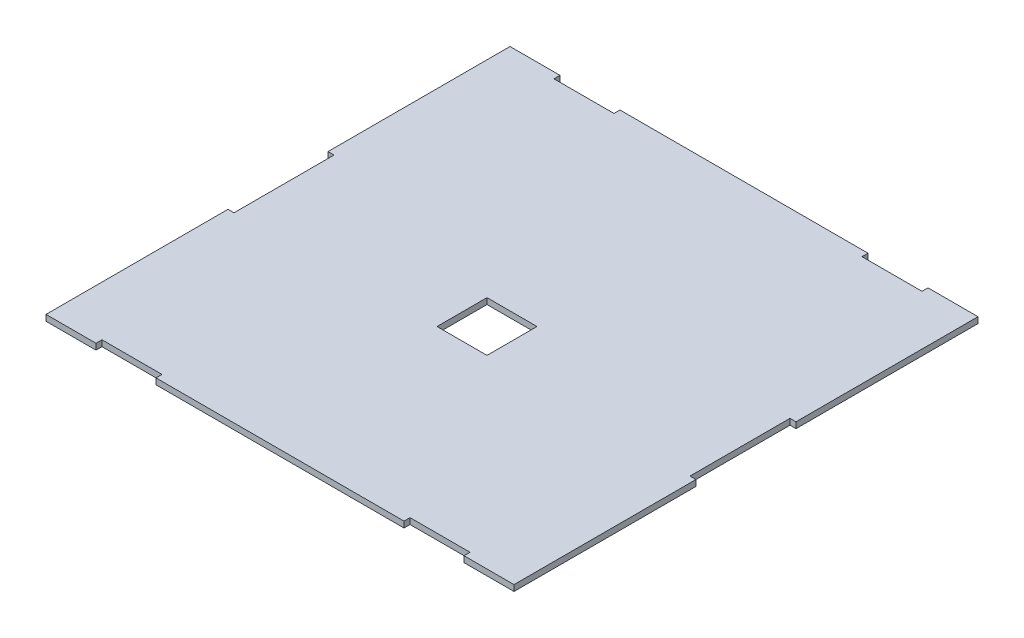
ISO-10303-21;
HEADER;
FILE_DESCRIPTION(('STEP AP214'),'2;1');
FILE_NAME('part.step','',(''),(''),'','','');
FILE_SCHEMA(('AUTOMOTIVE_DESIGN { 1 0 10303 214 1 1 1 1 }'));
ENDSEC;
DATA;
#1=APPLICATION_CONTEXT('core data for automotive mechanical design processes');
#2=APPLICATION_PROTOCOL_DEFINITION('international standard','automotive_design',2000,#1);
#3=PRODUCT_CONTEXT('',#1,'mechanical');
#4=PRODUCT('Part','Part','',(#3));
#5=PRODUCT_RELATED_PRODUCT_CATEGORY('part','',(#4));
#6=PRODUCT_DEFINITION_FORMATION('','',#4);
#7=PRODUCT_DEFINITION_CONTEXT('part definition',#1,'design');
#8=PRODUCT_DEFINITION('design','',#6,#7);
#9=PRODUCT_DEFINITION_SHAPE('','',#8);
#10=(LENGTH_UNIT() NAMED_UNIT(*) SI_UNIT(.MILLI.,.METRE.));
#11=(NAMED_UNIT(*) PLANE_ANGLE_UNIT() SI_UNIT($,.RADIAN.));
#12=(NAMED_UNIT(*) SI_UNIT($,.STERADIAN.) SOLID_ANGLE_UNIT());
#13=UNCERTAINTY_MEASURE_WITH_UNIT(LENGTH_MEASURE(1.E-05),#10,'distance_accuracy_value','');
#14=(GEOMETRIC_REPRESENTATION_CONTEXT(3) GLOBAL_UNCERTAINTY_ASSIGNED_CONTEXT((#13)) GLOBAL_UNIT_ASSIGNED_CONTEXT((#10,
#11,#12)) REPRESENTATION_CONTEXT('',''));
#15=CARTESIAN_POINT('',(0.,0.,0.));
#16=DIRECTION('',(0.,0.,1.));
#17=DIRECTION('',(1.,0.,0.));
#18=AXIS2_PLACEMENT_3D('',#15,#16,#17);
#19=CARTESIAN_POINT('',(0.,3.,-232.));
#20=DIRECTION('',(0.,0.,-1.));
#21=DIRECTION('',(-1.,0.,0.));
#22=AXIS2_PLACEMENT_3D('',#19,#20,#21);
#23=PLANE('',#22);
#24=DIRECTION('',(1.,0.,0.));
#25=VECTOR('',#24,1.);
#26=CARTESIAN_POINT('',(0.,0.,-232.));
#27=LINE('',#26,#25);
#28=CARTESIAN_POINT('',(209.,0.,-232.));
#29=VERTEX_POINT('',#28);
#30=CARTESIAN_POINT('',(234.,0.,-232.));
#31=VERTEX_POINT('',#30);
#32=EDGE_CURVE('E308',#29,#31,#27,.T.);
#33=ORIENTED_EDGE('',*,*,#32,.F.);
#34=DIRECTION('',(0.,-1.,0.));
#35=VECTOR('',#34,1.);
#36=CARTESIAN_POINT('',(209.,3.,-232.));
#37=LINE('',#36,#35);
#38=CARTESIAN_POINT('',(209.,3.,-232.));
#39=VERTEX_POINT('',#38);
#40=EDGE_CURVE('E11',#39,#29,#37,.T.);
#41=ORIENTED_EDGE('',*,*,#40,.F.);
#42=DIRECTION('',(1.,0.,0.));
#43=VECTOR('',#42,1.);
#44=CARTESIAN_POINT('',(0.,3.,-232.));
#45=LINE('',#44,#43);
#46=CARTESIAN_POINT('',(234.,3.,-232.));
#47=VERTEX_POINT('',#46);
#48=EDGE_CURVE('E573',#39,#47,#45,.T.);
#49=ORIENTED_EDGE('',*,*,#48,.T.);
#50=DIRECTION('',(0.,-1.,0.));
#51=VECTOR('',#50,1.);
#52=CARTESIAN_POINT('',(234.,3.,-232.));
#53=LINE('',#52,#51);
#54=EDGE_CURVE('E61',#47,#31,#53,.T.);
#55=ORIENTED_EDGE('',*,*,#54,.T.);
#56=EDGE_LOOP('',(#33,#41,#49,#55));
#57=FACE_BOUND('',#56,.T.);
#58=ADVANCED_FACE('F41',(#57),#23,.T.);
#59=CARTESIAN_POINT('',(209.,3.,0.));
#60=DIRECTION('',(1.,0.,0.));
#61=DIRECTION('',(0.,0.,-1.));
#62=AXIS2_PLACEMENT_3D('',#59,#60,#61);
#63=PLANE('',#62);
#64=DIRECTION('',(0.,0.,1.));
#65=VECTOR('',#64,1.);
#66=CARTESIAN_POINT('',(209.,0.,0.));
#67=LINE('',#66,#65);
#68=CARTESIAN_POINT('',(209.,0.,-229.));
#69=VERTEX_POINT('',#68);
#70=EDGE_CURVE('E311',#29,#69,#67,.T.);
#71=ORIENTED_EDGE('',*,*,#70,.T.);
#72=DIRECTION('',(0.,-1.,0.));
#73=VECTOR('',#72,1.);
#74=CARTESIAN_POINT('',(209.,3.,-229.));
#75=LINE('',#74,#73);
#76=CARTESIAN_POINT('',(209.,3.,-229.));
#77=VERTEX_POINT('',#76);
#78=EDGE_CURVE('E52',#77,#69,#75,.T.);
#79=ORIENTED_EDGE('',*,*,#78,.F.);
#80=DIRECTION('',(0.,0.,1.));
#81=VECTOR('',#80,1.);
#82=CARTESIAN_POINT('',(209.,3.,0.));
#83=LINE('',#82,#81);
#84=EDGE_CURVE('E954',#39,#77,#83,.T.);
#85=ORIENTED_EDGE('',*,*,#84,.F.);
#86=ORIENTED_EDGE('',*,*,#40,.T.);
#87=EDGE_LOOP('',(#71,#79,#85,#86));
#88=FACE_BOUND('',#87,.T.);
#89=ADVANCED_FACE('F521',(#88),#63,.F.);
#90=CARTESIAN_POINT('',(0.,3.,-229.));
#91=DIRECTION('',(0.,0.,-1.));
#92=DIRECTION('',(-1.,0.,0.));
#93=AXIS2_PLACEMENT_3D('',#90,#91,#92);
#94=PLANE('',#93);
#95=DIRECTION('',(1.,0.,0.));
#96=VECTOR('',#95,1.);
#97=CARTESIAN_POINT('',(0.,0.,-229.));
#98=LINE('',#97,#96);
#99=CARTESIAN_POINT('',(179.,0.,-229.));
#100=VERTEX_POINT('',#99);
#101=EDGE_CURVE('E317',#100,#69,#98,.T.);
#102=ORIENTED_EDGE('',*,*,#101,.F.);
#103=DIRECTION('',(0.,-1.,0.));
#104=VECTOR('',#103,1.);
#105=CARTESIAN_POINT('',(179.,3.,-229.));
#106=LINE('',#105,#104);
#107=CARTESIAN_POINT('',(179.,3.,-229.));
#108=VERTEX_POINT('',#107);
#109=EDGE_CURVE('E481',#108,#100,#106,.T.);
#110=ORIENTED_EDGE('',*,*,#109,.F.);
#111=DIRECTION('',(1.,0.,0.));
#112=VECTOR('',#111,1.);
#113=CARTESIAN_POINT('',(0.,3.,-229.));
#114=LINE('',#113,#112);
#115=EDGE_CURVE('E949',#108,#77,#114,.T.);
#116=ORIENTED_EDGE('',*,*,#115,.T.);
#117=ORIENTED_EDGE('',*,*,#78,.T.);
#118=EDGE_LOOP('',(#102,#110,#116,#117));
#119=FACE_BOUND('',#118,.T.);
#120=ADVANCED_FACE('F528',(#119),#94,.T.);
#121=CARTESIAN_POINT('',(179.,3.,0.));
#122=DIRECTION('',(1.,0.,0.));
#123=DIRECTION('',(0.,0.,-1.));
#124=AXIS2_PLACEMENT_3D('',#121,#122,#123);
#125=PLANE('',#124);
#126=DIRECTION('',(0.,0.,1.));
#127=VECTOR('',#126,1.);
#128=CARTESIAN_POINT('',(179.,0.,0.));
#129=LINE('',#128,#127);
#130=CARTESIAN_POINT('',(179.,0.,-232.));
#131=VERTEX_POINT('',#130);
#132=EDGE_CURVE('E321',#131,#100,#129,.T.);
#133=ORIENTED_EDGE('',*,*,#132,.F.);
#134=DIRECTION('',(0.,-1.,0.));
#135=VECTOR('',#134,1.);
#136=CARTESIAN_POINT('',(179.,3.,-232.));
#137=LINE('',#136,#135);
#138=CARTESIAN_POINT('',(179.,3.,-232.));
#139=VERTEX_POINT('',#138);
#140=EDGE_CURVE('E478',#139,#131,#137,.T.);
#141=ORIENTED_EDGE('',*,*,#140,.F.);
#142=DIRECTION('',(0.,0.,1.));
#143=VECTOR('',#142,1.);
#144=CARTESIAN_POINT('',(179.,3.,0.));
#145=LINE('',#144,#143);
#146=EDGE_CURVE('E945',#139,#108,#145,.T.);
#147=ORIENTED_EDGE('',*,*,#146,.T.);
#148=ORIENTED_EDGE('',*,*,#109,.T.);
#149=EDGE_LOOP('',(#133,#141,#147,#148));
#150=FACE_BOUND('',#149,.T.);
#151=ADVANCED_FACE('F535',(#150),#125,.T.);
#152=CARTESIAN_POINT('',(55.,0.,-232.));
#153=VERTEX_POINT('',#152);
#154=EDGE_CURVE('E313',#153,#131,#27,.T.);
#155=ORIENTED_EDGE('',*,*,#154,.F.);
#156=DIRECTION('',(0.,-1.,0.));
#157=VECTOR('',#156,1.);
#158=CARTESIAN_POINT('',(55.,3.,-232.));
#159=LINE('',#158,#157);
#160=CARTESIAN_POINT('',(55.,3.,-232.));
#161=VERTEX_POINT('',#160);
#162=EDGE_CURVE('E475',#161,#153,#159,.T.);
#163=ORIENTED_EDGE('',*,*,#162,.F.);
#164=EDGE_CURVE('E572',#161,#139,#45,.T.);
#165=ORIENTED_EDGE('',*,*,#164,.T.);
#166=ORIENTED_EDGE('',*,*,#140,.T.);
#167=EDGE_LOOP('',(#155,#163,#165,#166));
#168=FACE_BOUND('',#167,.T.);
#169=ADVANCED_FACE('F523',(#168),#23,.T.);
#170=CARTESIAN_POINT('',(55.,3.,0.));
#171=DIRECTION('',(1.,0.,0.));
#172=DIRECTION('',(0.,0.,-1.));
#173=AXIS2_PLACEMENT_3D('',#170,#171,#172);
#174=PLANE('',#173);
#175=DIRECTION('',(0.,0.,1.));
#176=VECTOR('',#175,1.);
#177=CARTESIAN_POINT('',(55.,0.,0.));
#178=LINE('',#177,#176);
#179=CARTESIAN_POINT('',(55.,0.,-229.));
#180=VERTEX_POINT('',#179);
#181=EDGE_CURVE('E325',#153,#180,#178,.T.);
#182=ORIENTED_EDGE('',*,*,#181,.T.);
#183=DIRECTION('',(0.,-1.,0.));
#184=VECTOR('',#183,1.);
#185=CARTESIAN_POINT('',(55.,3.,-229.));
#186=LINE('',#185,#184);
#187=CARTESIAN_POINT('',(55.,3.,-229.));
#188=VERTEX_POINT('',#187);
#189=EDGE_CURVE('E472',#188,#180,#186,.T.);
#190=ORIENTED_EDGE('',*,*,#189,.F.);
#191=DIRECTION('',(0.,0.,1.));
#192=VECTOR('',#191,1.);
#193=CARTESIAN_POINT('',(55.,3.,0.));
#194=LINE('',#193,#192);
#195=EDGE_CURVE('E953',#161,#188,#194,.T.);
#196=ORIENTED_EDGE('',*,*,#195,.F.);
#197=ORIENTED_EDGE('',*,*,#162,.T.);
#198=EDGE_LOOP('',(#182,#190,#196,#197));
#199=FACE_BOUND('',#198,.T.);
#200=ADVANCED_FACE('F534',(#199),#174,.F.);
#201=CARTESIAN_POINT('',(0.,3.,-229.));
#202=DIRECTION('',(0.,0.,-1.));
#203=DIRECTION('',(-1.,0.,0.));
#204=AXIS2_PLACEMENT_3D('',#201,#202,#203);
#205=PLANE('',#204);
#206=DIRECTION('',(1.,0.,0.));
#207=VECTOR('',#206,1.);
#208=CARTESIAN_POINT('',(0.,0.,-229.));
#209=LINE('',#208,#207);
#210=CARTESIAN_POINT('',(25.,0.,-229.));
#211=VERTEX_POINT('',#210);
#212=EDGE_CURVE('E329',#211,#180,#209,.T.);
#213=ORIENTED_EDGE('',*,*,#212,.F.);
#214=DIRECTION('',(0.,-1.,0.));
#215=VECTOR('',#214,1.);
#216=CARTESIAN_POINT('',(25.,3.,-229.));
#217=LINE('',#216,#215);
#218=CARTESIAN_POINT('',(25.,3.,-229.));
#219=VERTEX_POINT('',#218);
#220=EDGE_CURVE('E469',#219,#211,#217,.T.);
#221=ORIENTED_EDGE('',*,*,#220,.F.);
#222=DIRECTION('',(1.,0.,0.));
#223=VECTOR('',#222,1.);
#224=CARTESIAN_POINT('',(0.,3.,-229.));
#225=LINE('',#224,#223);
#226=EDGE_CURVE('E959',#219,#188,#225,.T.);
#227=ORIENTED_EDGE('',*,*,#226,.T.);
#228=ORIENTED_EDGE('',*,*,#189,.T.);
#229=EDGE_LOOP('',(#213,#221,#227,#228));
#230=FACE_BOUND('',#229,.T.);
#231=ADVANCED_FACE('F547',(#230),#205,.T.);
#232=CARTESIAN_POINT('',(25.,3.,0.));
#233=DIRECTION('',(1.,0.,0.));
#234=DIRECTION('',(0.,0.,-1.));
#235=AXIS2_PLACEMENT_3D('',#232,#233,#234);
#236=PLANE('',#235);
#237=DIRECTION('',(0.,0.,1.));
#238=VECTOR('',#237,1.);
#239=CARTESIAN_POINT('',(25.,0.,0.));
#240=LINE('',#239,#238);
#241=CARTESIAN_POINT('',(25.,0.,-232.));
#242=VERTEX_POINT('',#241);
#243=EDGE_CURVE('E333',#242,#211,#240,.T.);
#244=ORIENTED_EDGE('',*,*,#243,.F.);
#245=DIRECTION('',(0.,-1.,0.));
#246=VECTOR('',#245,1.);
#247=CARTESIAN_POINT('',(25.,3.,-232.));
#248=LINE('',#247,#246);
#249=CARTESIAN_POINT('',(25.,3.,-232.));
#250=VERTEX_POINT('',#249);
#251=EDGE_CURVE('E466',#250,#242,#248,.T.);
#252=ORIENTED_EDGE('',*,*,#251,.F.);
#253=DIRECTION('',(0.,0.,1.));
#254=VECTOR('',#253,1.);
#255=CARTESIAN_POINT('',(25.,3.,0.));
#256=LINE('',#255,#254);
#257=EDGE_CURVE('E570',#250,#219,#256,.T.);
#258=ORIENTED_EDGE('',*,*,#257,.T.);
#259=ORIENTED_EDGE('',*,*,#220,.T.);
#260=EDGE_LOOP('',(#244,#252,#258,#259));
#261=FACE_BOUND('',#260,.T.);
#262=ADVANCED_FACE('F539',(#261),#236,.T.);
#263=CARTESIAN_POINT('',(0.,0.,-232.));
#264=VERTEX_POINT('',#263);
#265=EDGE_CURVE('E312',#264,#242,#27,.T.);
#266=ORIENTED_EDGE('',*,*,#265,.F.);
#267=DIRECTION('',(0.,-1.,0.));
#268=VECTOR('',#267,1.);
#269=CARTESIAN_POINT('',(0.,3.,-232.));
#270=LINE('',#269,#268);
#271=CARTESIAN_POINT('',(0.,3.,-232.));
#272=VERTEX_POINT('',#271);
#273=EDGE_CURVE('E463',#272,#264,#270,.T.);
#274=ORIENTED_EDGE('',*,*,#273,.F.);
#275=EDGE_CURVE('E564',#272,#250,#45,.T.);
#276=ORIENTED_EDGE('',*,*,#275,.T.);
#277=ORIENTED_EDGE('',*,*,#251,.T.);
#278=EDGE_LOOP('',(#266,#274,#276,#277));
#279=FACE_BOUND('',#278,.T.);
#280=ADVANCED_FACE('F524',(#279),#23,.T.);
#281=CARTESIAN_POINT('',(0.,3.,0.));
#282=DIRECTION('',(-1.,0.,0.));
#283=DIRECTION('',(0.,0.,1.));
#284=AXIS2_PLACEMENT_3D('',#281,#282,#283);
#285=PLANE('',#284);
#286=DIRECTION('',(0.,0.,-1.));
#287=VECTOR('',#286,1.);
#288=CARTESIAN_POINT('',(0.,0.,0.));
#289=LINE('',#288,#287);
#290=CARTESIAN_POINT('',(0.,0.,-141.));
#291=VERTEX_POINT('',#290);
#292=EDGE_CURVE('E337',#291,#264,#289,.T.);
#293=ORIENTED_EDGE('',*,*,#292,.F.);
#294=DIRECTION('',(0.,-1.,0.));
#295=VECTOR('',#294,1.);
#296=CARTESIAN_POINT('',(0.,3.,-141.));
#297=LINE('',#296,#295);
#298=CARTESIAN_POINT('',(0.,3.,-141.));
#299=VERTEX_POINT('',#298);
#300=EDGE_CURVE('E460',#299,#291,#297,.T.);
#301=ORIENTED_EDGE('',*,*,#300,.F.);
#302=DIRECTION('',(0.,0.,-1.));
#303=VECTOR('',#302,1.);
#304=CARTESIAN_POINT('',(0.,3.,0.));
#305=LINE('',#304,#303);
#306=EDGE_CURVE('E559',#299,#272,#305,.T.);
#307=ORIENTED_EDGE('',*,*,#306,.T.);
#308=ORIENTED_EDGE('',*,*,#273,.T.);
#309=EDGE_LOOP('',(#293,#301,#307,#308));
#310=FACE_BOUND('',#309,.T.);
#311=ADVANCED_FACE('F538',(#310),#285,.T.);
#312=CARTESIAN_POINT('',(0.,3.,-141.));
#313=DIRECTION('',(0.,0.,1.));
#314=DIRECTION('',(1.,0.,0.));
#315=AXIS2_PLACEMENT_3D('',#312,#313,#314);
#316=PLANE('',#315);
#317=DIRECTION('',(-1.,0.,0.));
#318=VECTOR('',#317,1.);
#319=CARTESIAN_POINT('',(0.,0.,-141.));
#320=LINE('',#319,#318);
#321=CARTESIAN_POINT('',(3.,0.,-141.));
#322=VERTEX_POINT('',#321);
#323=EDGE_CURVE('E341',#322,#291,#320,.T.);
#324=ORIENTED_EDGE('',*,*,#323,.F.);
#325=DIRECTION('',(0.,-1.,0.));
#326=VECTOR('',#325,1.);
#327=CARTESIAN_POINT('',(3.,3.,-141.));
#328=LINE('',#327,#326);
#329=CARTESIAN_POINT('',(3.,3.,-141.));
#330=VERTEX_POINT('',#329);
#331=EDGE_CURVE('E457',#330,#322,#328,.T.);
#332=ORIENTED_EDGE('',*,*,#331,.F.);
#333=DIRECTION('',(-1.,0.,0.));
#334=VECTOR('',#333,1.);
#335=CARTESIAN_POINT('',(0.,3.,-141.));
#336=LINE('',#335,#334);
#337=EDGE_CURVE('E563',#330,#299,#336,.T.);
#338=ORIENTED_EDGE('',*,*,#337,.T.);
#339=ORIENTED_EDGE('',*,*,#300,.T.);
#340=EDGE_LOOP('',(#324,#332,#338,#339));
#341=FACE_BOUND('',#340,.T.);
#342=ADVANCED_FACE('F545',(#341),#316,.T.);
#343=CARTESIAN_POINT('',(3.,3.,0.));
#344=DIRECTION('',(-1.,0.,0.));
#345=DIRECTION('',(0.,0.,1.));
#346=AXIS2_PLACEMENT_3D('',#343,#344,#345);
#347=PLANE('',#346);
#348=DIRECTION('',(0.,0.,-1.));
#349=VECTOR('',#348,1.);
#350=CARTESIAN_POINT('',(3.,0.,0.));
#351=LINE('',#350,#349);
#352=CARTESIAN_POINT('',(3.,0.,-91.));
#353=VERTEX_POINT('',#352);
#354=EDGE_CURVE('E345',#353,#322,#351,.T.);
#355=ORIENTED_EDGE('',*,*,#354,.F.);
#356=DIRECTION('',(0.,-1.,0.));
#357=VECTOR('',#356,1.);
#358=CARTESIAN_POINT('',(3.,3.,-91.));
#359=LINE('',#358,#357);
#360=CARTESIAN_POINT('',(3.,3.,-91.));
#361=VERTEX_POINT('',#360);
#362=EDGE_CURVE('E454',#361,#353,#359,.T.);
#363=ORIENTED_EDGE('',*,*,#362,.F.);
#364=DIRECTION('',(0.,0.,-1.));
#365=VECTOR('',#364,1.);
#366=CARTESIAN_POINT('',(3.,3.,0.));
#367=LINE('',#366,#365);
#368=EDGE_CURVE('E568',#361,#330,#367,.T.);
#369=ORIENTED_EDGE('',*,*,#368,.T.);
#370=ORIENTED_EDGE('',*,*,#331,.T.);
#371=EDGE_LOOP('',(#355,#363,#369,#370));
#372=FACE_BOUND('',#371,.T.);
#373=ADVANCED_FACE('F693',(#372),#347,.T.);
#374=CARTESIAN_POINT('',(0.,3.,-91.));
#375=DIRECTION('',(0.,0.,-1.));
#376=DIRECTION('',(-1.,0.,0.));
#377=AXIS2_PLACEMENT_3D('',#374,#375,#376);
#378=PLANE('',#377);
#379=DIRECTION('',(1.,0.,0.));
#380=VECTOR('',#379,1.);
#381=CARTESIAN_POINT('',(0.,0.,-91.));
#382=LINE('',#381,#380);
#383=CARTESIAN_POINT('',(0.,0.,-91.));
#384=VERTEX_POINT('',#383);
#385=EDGE_CURVE('E349',#384,#353,#382,.T.);
#386=ORIENTED_EDGE('',*,*,#385,.F.);
#387=DIRECTION('',(0.,-1.,0.));
#388=VECTOR('',#387,1.);
#389=CARTESIAN_POINT('',(0.,3.,-91.));
#390=LINE('',#389,#388);
#391=CARTESIAN_POINT('',(0.,3.,-91.));
#392=VERTEX_POINT('',#391);
#393=EDGE_CURVE('E451',#392,#384,#390,.T.);
#394=ORIENTED_EDGE('',*,*,#393,.F.);
#395=DIRECTION('',(1.,0.,0.));
#396=VECTOR('',#395,1.);
#397=CARTESIAN_POINT('',(0.,3.,-91.));
#398=LINE('',#397,#396);
#399=EDGE_CURVE('E580',#392,#361,#398,.T.);
#400=ORIENTED_EDGE('',*,*,#399,.T.);
#401=ORIENTED_EDGE('',*,*,#362,.T.);
#402=EDGE_LOOP('',(#386,#394,#400,#401));
#403=FACE_BOUND('',#402,.T.);
#404=ADVANCED_FACE('F689',(#403),#378,.T.);
#405=CARTESIAN_POINT('',(0.,3.,0.));
#406=DIRECTION('',(-1.,0.,0.));
#407=DIRECTION('',(0.,0.,1.));
#408=AXIS2_PLACEMENT_3D('',#405,#406,#407);
#409=PLANE('',#408);
#410=DIRECTION('',(0.,0.,-1.));
#411=VECTOR('',#410,1.);
#412=CARTESIAN_POINT('',(0.,0.,0.));
#413=LINE('',#412,#411);
#414=CARTESIAN_POINT('',(0.,0.,0.));
#415=VERTEX_POINT('',#414);
#416=EDGE_CURVE('E353',#415,#384,#413,.T.);
#417=ORIENTED_EDGE('',*,*,#416,.F.);
#418=DIRECTION('',(0.,-1.,0.));
#419=VECTOR('',#418,1.);
#420=CARTESIAN_POINT('',(0.,3.,0.));
#421=LINE('',#420,#419);
#422=CARTESIAN_POINT('',(0.,3.,0.));
#423=VERTEX_POINT('',#422);
#424=EDGE_CURVE('E448',#423,#415,#421,.T.);
#425=ORIENTED_EDGE('',*,*,#424,.F.);
#426=DIRECTION('',(0.,0.,-1.));
#427=VECTOR('',#426,1.);
#428=CARTESIAN_POINT('',(0.,3.,0.));
#429=LINE('',#428,#427);
#430=EDGE_CURVE('E584',#423,#392,#429,.T.);
#431=ORIENTED_EDGE('',*,*,#430,.T.);
#432=ORIENTED_EDGE('',*,*,#393,.T.);
#433=EDGE_LOOP('',(#417,#425,#431,#432));
#434=FACE_BOUND('',#433,.T.);
#435=ADVANCED_FACE('F685',(#434),#409,.T.);
#436=CARTESIAN_POINT('',(0.,3.,0.));
#437=DIRECTION('',(0.,0.,1.));
#438=DIRECTION('',(1.,0.,0.));
#439=AXIS2_PLACEMENT_3D('',#436,#437,#438);
#440=PLANE('',#439);
#441=DIRECTION('',(-1.,0.,0.));
#442=VECTOR('',#441,1.);
#443=CARTESIAN_POINT('',(0.,0.,0.));
#444=LINE('',#443,#442);
#445=CARTESIAN_POINT('',(25.,0.,0.));
#446=VERTEX_POINT('',#445);
#447=EDGE_CURVE('E357',#446,#415,#444,.T.);
#448=ORIENTED_EDGE('',*,*,#447,.F.);
#449=DIRECTION('',(0.,-1.,0.));
#450=VECTOR('',#449,1.);
#451=CARTESIAN_POINT('',(25.,3.,0.));
#452=LINE('',#451,#450);
#453=CARTESIAN_POINT('',(25.,3.,0.));
#454=VERTEX_POINT('',#453);
#455=EDGE_CURVE('E445',#454,#446,#452,.T.);
#456=ORIENTED_EDGE('',*,*,#455,.F.);
#457=DIRECTION('',(-1.,0.,0.));
#458=VECTOR('',#457,1.);
#459=CARTESIAN_POINT('',(0.,3.,0.));
#460=LINE('',#459,#458);
#461=EDGE_CURVE('E588',#454,#423,#460,.T.);
#462=ORIENTED_EDGE('',*,*,#461,.T.);
#463=ORIENTED_EDGE('',*,*,#424,.T.);
#464=EDGE_LOOP('',(#448,#456,#462,#463));
#465=FACE_BOUND('',#464,.T.);
#466=ADVANCED_FACE('F681',(#465),#440,.T.);
#467=CARTESIAN_POINT('',(25.,3.,0.));
#468=DIRECTION('',(-1.,0.,0.));
#469=DIRECTION('',(0.,0.,1.));
#470=AXIS2_PLACEMENT_3D('',#467,#468,#469);
#471=PLANE('',#470);
#472=DIRECTION('',(0.,0.,-1.));
#473=VECTOR('',#472,1.);
#474=CARTESIAN_POINT('',(25.,0.,0.));
#475=LINE('',#474,#473);
#476=CARTESIAN_POINT('',(25.,0.,-3.));
#477=VERTEX_POINT('',#476);
#478=EDGE_CURVE('E361',#446,#477,#475,.T.);
#479=ORIENTED_EDGE('',*,*,#478,.T.);
#480=DIRECTION('',(0.,-1.,0.));
#481=VECTOR('',#480,1.);
#482=CARTESIAN_POINT('',(25.,3.,-3.));
#483=LINE('',#482,#481);
#484=CARTESIAN_POINT('',(25.,3.,-3.));
#485=VERTEX_POINT('',#484);
#486=EDGE_CURVE('E441',#485,#477,#483,.T.);
#487=ORIENTED_EDGE('',*,*,#486,.F.);
#488=DIRECTION('',(0.,0.,-1.));
#489=VECTOR('',#488,1.);
#490=CARTESIAN_POINT('',(25.,3.,0.));
#491=LINE('',#490,#489);
#492=EDGE_CURVE('E592',#454,#485,#491,.T.);
#493=ORIENTED_EDGE('',*,*,#492,.F.);
#494=ORIENTED_EDGE('',*,*,#455,.T.);
#495=EDGE_LOOP('',(#479,#487,#493,#494));
#496=FACE_BOUND('',#495,.T.);
#497=ADVANCED_FACE('F677',(#496),#471,.F.);
#498=CARTESIAN_POINT('',(0.,3.,-3.));
#499=DIRECTION('',(0.,0.,-1.));
#500=DIRECTION('',(-1.,0.,0.));
#501=AXIS2_PLACEMENT_3D('',#498,#499,#500);
#502=PLANE('',#501);
#503=DIRECTION('',(1.,0.,0.));
#504=VECTOR('',#503,1.);
#505=CARTESIAN_POINT('',(0.,0.,-3.));
#506=LINE('',#505,#504);
#507=CARTESIAN_POINT('',(55.,0.,-3.));
#508=VERTEX_POINT('',#507);
#509=EDGE_CURVE('E365',#477,#508,#506,.T.);
#510=ORIENTED_EDGE('',*,*,#509,.T.);
#511=DIRECTION('',(0.,-1.,0.));
#512=VECTOR('',#511,1.);
#513=CARTESIAN_POINT('',(55.,3.,-3.));
#514=LINE('',#513,#512);
#515=CARTESIAN_POINT('',(55.,3.,-3.));
#516=VERTEX_POINT('',#515);
#517=EDGE_CURVE('E438',#516,#508,#514,.T.);
#518=ORIENTED_EDGE('',*,*,#517,.F.);
#519=DIRECTION('',(1.,0.,0.));
#520=VECTOR('',#519,1.);
#521=CARTESIAN_POINT('',(0.,3.,-3.));
#522=LINE('',#521,#520);
#523=EDGE_CURVE('E596',#485,#516,#522,.T.);
#524=ORIENTED_EDGE('',*,*,#523,.F.);
#525=ORIENTED_EDGE('',*,*,#486,.T.);
#526=EDGE_LOOP('',(#510,#518,#524,#525));
#527=FACE_BOUND('',#526,.T.);
#528=ADVANCED_FACE('F673',(#527),#502,.F.);
#529=CARTESIAN_POINT('',(55.,3.,1.27213054904966E-13));
#530=DIRECTION('',(-1.,0.,0.));
#531=DIRECTION('',(0.,0.,1.));
#532=AXIS2_PLACEMENT_3D('',#529,#530,#531);
#533=PLANE('',#532);
#534=DIRECTION('',(0.,0.,-1.));
#535=VECTOR('',#534,1.);
#536=CARTESIAN_POINT('',(55.,0.,1.27213054904966E-13));
#537=LINE('',#536,#535);
#538=CARTESIAN_POINT('',(55.,0.,0.));
#539=VERTEX_POINT('',#538);
#540=EDGE_CURVE('E369',#539,#508,#537,.T.);
#541=ORIENTED_EDGE('',*,*,#540,.F.);
#542=DIRECTION('',(0.,-1.,0.));
#543=VECTOR('',#542,1.);
#544=CARTESIAN_POINT('',(55.,3.,0.));
#545=LINE('',#544,#543);
#546=CARTESIAN_POINT('',(55.,3.,0.));
#547=VERTEX_POINT('',#546);
#548=EDGE_CURVE('E435',#547,#539,#545,.T.);
#549=ORIENTED_EDGE('',*,*,#548,.F.);
#550=DIRECTION('',(0.,0.,-1.));
#551=VECTOR('',#550,1.);
#552=CARTESIAN_POINT('',(55.,3.,1.27213054904966E-13));
#553=LINE('',#552,#551);
#554=EDGE_CURVE('E599',#547,#516,#553,.T.);
#555=ORIENTED_EDGE('',*,*,#554,.T.);
#556=ORIENTED_EDGE('',*,*,#517,.T.);
#557=EDGE_LOOP('',(#541,#549,#555,#556));
#558=FACE_BOUND('',#557,.T.);
#559=ADVANCED_FACE('F669',(#558),#533,.T.);
#560=CARTESIAN_POINT('',(0.,3.,0.));
#561=DIRECTION('',(0.,0.,1.));
#562=DIRECTION('',(1.,0.,0.));
#563=AXIS2_PLACEMENT_3D('',#560,#561,#562);
#564=PLANE('',#563);
#565=DIRECTION('',(-1.,0.,0.));
#566=VECTOR('',#565,1.);
#567=CARTESIAN_POINT('',(0.,0.,0.));
#568=LINE('',#567,#566);
#569=CARTESIAN_POINT('',(179.,0.,0.));
#570=VERTEX_POINT('',#569);
#571=EDGE_CURVE('E373',#570,#539,#568,.T.);
#572=ORIENTED_EDGE('',*,*,#571,.F.);
#573=DIRECTION('',(0.,-1.,0.));
#574=VECTOR('',#573,1.);
#575=CARTESIAN_POINT('',(179.,3.,0.));
#576=LINE('',#575,#574);
#577=CARTESIAN_POINT('',(179.,3.,0.));
#578=VERTEX_POINT('',#577);
#579=EDGE_CURVE('E432',#578,#570,#576,.T.);
#580=ORIENTED_EDGE('',*,*,#579,.F.);
#581=DIRECTION('',(-1.,0.,0.));
#582=VECTOR('',#581,1.);
#583=CARTESIAN_POINT('',(0.,3.,0.));
#584=LINE('',#583,#582);
#585=EDGE_CURVE('E603',#578,#547,#584,.T.);
#586=ORIENTED_EDGE('',*,*,#585,.T.);
#587=ORIENTED_EDGE('',*,*,#548,.T.);
#588=EDGE_LOOP('',(#572,#580,#586,#587));
#589=FACE_BOUND('',#588,.T.);
#590=ADVANCED_FACE('F665',(#589),#564,.T.);
#591=CARTESIAN_POINT('',(179.,3.,0.));
#592=DIRECTION('',(-1.,0.,0.));
#593=DIRECTION('',(0.,0.,1.));
#594=AXIS2_PLACEMENT_3D('',#591,#592,#593);
#595=PLANE('',#594);
#596=DIRECTION('',(0.,0.,-1.));
#597=VECTOR('',#596,1.);
#598=CARTESIAN_POINT('',(179.,0.,0.));
#599=LINE('',#598,#597);
#600=CARTESIAN_POINT('',(179.,0.,-2.99999999999997));
#601=VERTEX_POINT('',#600);
#602=EDGE_CURVE('E377',#570,#601,#599,.T.);
#603=ORIENTED_EDGE('',*,*,#602,.T.);
#604=DIRECTION('',(0.,-1.,0.));
#605=VECTOR('',#604,1.);
#606=CARTESIAN_POINT('',(179.,3.,-2.99999999999997));
#607=LINE('',#606,#605);
#608=CARTESIAN_POINT('',(179.,3.,-2.99999999999997));
#609=VERTEX_POINT('',#608);
#610=EDGE_CURVE('E429',#609,#601,#607,.T.);
#611=ORIENTED_EDGE('',*,*,#610,.F.);
#612=DIRECTION('',(0.,0.,-1.));
#613=VECTOR('',#612,1.);
#614=CARTESIAN_POINT('',(179.,3.,0.));
#615=LINE('',#614,#613);
#616=EDGE_CURVE('E607',#578,#609,#615,.T.);
#617=ORIENTED_EDGE('',*,*,#616,.F.);
#618=ORIENTED_EDGE('',*,*,#579,.T.);
#619=EDGE_LOOP('',(#603,#611,#617,#618));
#620=FACE_BOUND('',#619,.T.);
#621=ADVANCED_FACE('F661',(#620),#595,.F.);
#622=CARTESIAN_POINT('',(0.,3.,-2.99999999999995));
#623=DIRECTION('',(0.,0.,1.));
#624=DIRECTION('',(1.,0.,0.));
#625=AXIS2_PLACEMENT_3D('',#622,#623,#624);
#626=PLANE('',#625);
#627=DIRECTION('',(-1.,0.,0.));
#628=VECTOR('',#627,1.);
#629=CARTESIAN_POINT('',(0.,0.,-2.99999999999995));
#630=LINE('',#629,#628);
#631=CARTESIAN_POINT('',(209.,0.,-2.99999999999998));
#632=VERTEX_POINT('',#631);
#633=EDGE_CURVE('E381',#632,#601,#630,.T.);
#634=ORIENTED_EDGE('',*,*,#633,.F.);
#635=DIRECTION('',(0.,-1.,0.));
#636=VECTOR('',#635,1.);
#637=CARTESIAN_POINT('',(209.,3.,-2.99999999999998));
#638=LINE('',#637,#636);
#639=CARTESIAN_POINT('',(209.,3.,-2.99999999999998));
#640=VERTEX_POINT('',#639);
#641=EDGE_CURVE('E426',#640,#632,#638,.T.);
#642=ORIENTED_EDGE('',*,*,#641,.F.);
#643=DIRECTION('',(-1.,0.,0.));
#644=VECTOR('',#643,1.);
#645=CARTESIAN_POINT('',(0.,3.,-2.99999999999995));
#646=LINE('',#645,#644);
#647=EDGE_CURVE('E610',#640,#609,#646,.T.);
#648=ORIENTED_EDGE('',*,*,#647,.T.);
#649=ORIENTED_EDGE('',*,*,#610,.T.);
#650=EDGE_LOOP('',(#634,#642,#648,#649));
#651=FACE_BOUND('',#650,.T.);
#652=ADVANCED_FACE('F657',(#651),#626,.T.);
#653=CARTESIAN_POINT('',(209.,3.,0.));
#654=DIRECTION('',(-1.,0.,0.));
#655=DIRECTION('',(0.,0.,1.));
#656=AXIS2_PLACEMENT_3D('',#653,#654,#655);
#657=PLANE('',#656);
#658=DIRECTION('',(0.,0.,-1.));
#659=VECTOR('',#658,1.);
#660=CARTESIAN_POINT('',(209.,0.,0.));
#661=LINE('',#660,#659);
#662=CARTESIAN_POINT('',(209.,0.,-1.76094412542996E-13));
#663=VERTEX_POINT('',#662);
#664=EDGE_CURVE('E385',#663,#632,#661,.T.);
#665=ORIENTED_EDGE('',*,*,#664,.F.);
#666=DIRECTION('',(0.,-1.,0.));
#667=VECTOR('',#666,1.);
#668=CARTESIAN_POINT('',(209.,3.,-1.76094412542996E-13));
#669=LINE('',#668,#667);
#670=CARTESIAN_POINT('',(209.,3.,-1.76094412542996E-13));
#671=VERTEX_POINT('',#670);
#672=EDGE_CURVE('E423',#671,#663,#669,.T.);
#673=ORIENTED_EDGE('',*,*,#672,.F.);
#674=DIRECTION('',(0.,0.,-1.));
#675=VECTOR('',#674,1.);
#676=CARTESIAN_POINT('',(209.,3.,0.));
#677=LINE('',#676,#675);
#678=EDGE_CURVE('E614',#671,#640,#677,.T.);
#679=ORIENTED_EDGE('',*,*,#678,.T.);
#680=ORIENTED_EDGE('',*,*,#641,.T.);
#681=EDGE_LOOP('',(#665,#673,#679,#680));
#682=FACE_BOUND('',#681,.T.);
#683=ADVANCED_FACE('F653',(#682),#657,.T.);
#684=CARTESIAN_POINT('',(0.,3.,0.));
#685=DIRECTION('',(0.,0.,1.));
#686=DIRECTION('',(1.,0.,0.));
#687=AXIS2_PLACEMENT_3D('',#684,#685,#686);
#688=PLANE('',#687);
#689=DIRECTION('',(-1.,0.,0.));
#690=VECTOR('',#689,1.);
#691=CARTESIAN_POINT('',(0.,0.,0.));
#692=LINE('',#691,#690);
#693=CARTESIAN_POINT('',(234.,0.,0.));
#694=VERTEX_POINT('',#693);
#695=EDGE_CURVE('E389',#694,#663,#692,.T.);
#696=ORIENTED_EDGE('',*,*,#695,.F.);
#697=DIRECTION('',(0.,-1.,0.));
#698=VECTOR('',#697,1.);
#699=CARTESIAN_POINT('',(234.,3.,0.));
#700=LINE('',#699,#698);
#701=CARTESIAN_POINT('',(234.,3.,0.));
#702=VERTEX_POINT('',#701);
#703=EDGE_CURVE('E420',#702,#694,#700,.T.);
#704=ORIENTED_EDGE('',*,*,#703,.F.);
#705=DIRECTION('',(-1.,0.,0.));
#706=VECTOR('',#705,1.);
#707=CARTESIAN_POINT('',(0.,3.,0.));
#708=LINE('',#707,#706);
#709=EDGE_CURVE('E618',#702,#671,#708,.T.);
#710=ORIENTED_EDGE('',*,*,#709,.T.);
#711=ORIENTED_EDGE('',*,*,#672,.T.);
#712=EDGE_LOOP('',(#696,#704,#710,#711));
#713=FACE_BOUND('',#712,.T.);
#714=ADVANCED_FACE('F649',(#713),#688,.T.);
#715=CARTESIAN_POINT('',(234.,3.,0.));
#716=DIRECTION('',(1.,0.,0.));
#717=DIRECTION('',(0.,0.,-1.));
#718=AXIS2_PLACEMENT_3D('',#715,#716,#717);
#719=PLANE('',#718);
#720=DIRECTION('',(0.,0.,1.));
#721=VECTOR('',#720,1.);
#722=CARTESIAN_POINT('',(234.,0.,0.));
#723=LINE('',#722,#721);
#724=CARTESIAN_POINT('',(234.,0.,-91.));
#725=VERTEX_POINT('',#724);
#726=EDGE_CURVE('E393',#725,#694,#723,.T.);
#727=ORIENTED_EDGE('',*,*,#726,.F.);
#728=DIRECTION('',(0.,-1.,0.));
#729=VECTOR('',#728,1.);
#730=CARTESIAN_POINT('',(234.,3.,-91.));
#731=LINE('',#730,#729);
#732=CARTESIAN_POINT('',(234.,3.,-91.));
#733=VERTEX_POINT('',#732);
#734=EDGE_CURVE('E417',#733,#725,#731,.T.);
#735=ORIENTED_EDGE('',*,*,#734,.F.);
#736=DIRECTION('',(0.,0.,1.));
#737=VECTOR('',#736,1.);
#738=CARTESIAN_POINT('',(234.,3.,0.));
#739=LINE('',#738,#737);
#740=EDGE_CURVE('E622',#733,#702,#739,.T.);
#741=ORIENTED_EDGE('',*,*,#740,.T.);
#742=ORIENTED_EDGE('',*,*,#703,.T.);
#743=EDGE_LOOP('',(#727,#735,#741,#742));
#744=FACE_BOUND('',#743,.T.);
#745=ADVANCED_FACE('F646',(#744),#719,.T.);
#746=CARTESIAN_POINT('',(0.,3.,-91.));
#747=DIRECTION('',(0.,0.,-1.));
#748=DIRECTION('',(-1.,0.,0.));
#749=AXIS2_PLACEMENT_3D('',#746,#747,#748);
#750=PLANE('',#749);
#751=DIRECTION('',(1.,0.,0.));
#752=VECTOR('',#751,1.);
#753=CARTESIAN_POINT('',(0.,0.,-91.));
#754=LINE('',#753,#752);
#755=CARTESIAN_POINT('',(231.,0.,-91.));
#756=VERTEX_POINT('',#755);
#757=EDGE_CURVE('E397',#756,#725,#754,.T.);
#758=ORIENTED_EDGE('',*,*,#757,.F.);
#759=DIRECTION('',(0.,-1.,0.));
#760=VECTOR('',#759,1.);
#761=CARTESIAN_POINT('',(231.,3.,-91.));
#762=LINE('',#761,#760);
#763=CARTESIAN_POINT('',(231.,3.,-91.));
#764=VERTEX_POINT('',#763);
#765=EDGE_CURVE('E269',#764,#756,#762,.T.);
#766=ORIENTED_EDGE('',*,*,#765,.F.);
#767=DIRECTION('',(1.,0.,0.));
#768=VECTOR('',#767,1.);
#769=CARTESIAN_POINT('',(0.,3.,-91.));
#770=LINE('',#769,#768);
#771=EDGE_CURVE('E280',#764,#733,#770,.T.);
#772=ORIENTED_EDGE('',*,*,#771,.T.);
#773=ORIENTED_EDGE('',*,*,#734,.T.);
#774=EDGE_LOOP('',(#758,#766,#772,#773));
#775=FACE_BOUND('',#774,.T.);
#776=ADVANCED_FACE('F628',(#775),#750,.T.);
#777=CARTESIAN_POINT('',(231.,3.,-1.28230759344206E-13));
#778=DIRECTION('',(1.,0.,0.));
#779=DIRECTION('',(0.,0.,-1.));
#780=AXIS2_PLACEMENT_3D('',#777,#778,#779);
#781=PLANE('',#780);
#782=DIRECTION('',(0.,0.,1.));
#783=VECTOR('',#782,1.);
#784=CARTESIAN_POINT('',(231.,0.,-1.28230759344206E-13));
#785=LINE('',#784,#783);
#786=CARTESIAN_POINT('',(231.,0.,-141.));
#787=VERTEX_POINT('',#786);
#788=EDGE_CURVE('E264',#787,#756,#785,.T.);
#789=ORIENTED_EDGE('',*,*,#788,.F.);
#790=DIRECTION('',(0.,-1.,0.));
#791=VECTOR('',#790,1.);
#792=CARTESIAN_POINT('',(231.,3.,-141.));
#793=LINE('',#792,#791);
#794=CARTESIAN_POINT('',(231.,3.,-141.));
#795=VERTEX_POINT('',#794);
#796=EDGE_CURVE('E259',#795,#787,#793,.T.);
#797=ORIENTED_EDGE('',*,*,#796,.F.);
#798=DIRECTION('',(0.,0.,1.));
#799=VECTOR('',#798,1.);
#800=CARTESIAN_POINT('',(231.,3.,-1.28230759344206E-13));
#801=LINE('',#800,#799);
#802=EDGE_CURVE('E262',#795,#764,#801,.T.);
#803=ORIENTED_EDGE('',*,*,#802,.T.);
#804=ORIENTED_EDGE('',*,*,#765,.T.);
#805=EDGE_LOOP('',(#789,#797,#803,#804));
#806=FACE_BOUND('',#805,.T.);
#807=ADVANCED_FACE('F261',(#806),#781,.T.);
#808=CARTESIAN_POINT('',(0.,3.,-141.));
#809=DIRECTION('',(0.,0.,1.));
#810=DIRECTION('',(1.,0.,0.));
#811=AXIS2_PLACEMENT_3D('',#808,#809,#810);
#812=PLANE('',#811);
#813=DIRECTION('',(-1.,0.,0.));
#814=VECTOR('',#813,1.);
#815=CARTESIAN_POINT('',(0.,0.,-141.));
#816=LINE('',#815,#814);
#817=CARTESIAN_POINT('',(234.,0.,-141.));
#818=VERTEX_POINT('',#817);
#819=EDGE_CURVE('E403',#818,#787,#816,.T.);
#820=ORIENTED_EDGE('',*,*,#819,.F.);
#821=DIRECTION('',(0.,-1.,0.));
#822=VECTOR('',#821,1.);
#823=CARTESIAN_POINT('',(234.,3.,-141.));
#824=LINE('',#823,#822);
#825=CARTESIAN_POINT('',(234.,3.,-141.));
#826=VERTEX_POINT('',#825);
#827=EDGE_CURVE('E158',#826,#818,#824,.T.);
#828=ORIENTED_EDGE('',*,*,#827,.F.);
#829=DIRECTION('',(-1.,0.,0.));
#830=VECTOR('',#829,1.);
#831=CARTESIAN_POINT('',(0.,3.,-141.));
#832=LINE('',#831,#830);
#833=EDGE_CURVE('E277',#826,#795,#832,.T.);
#834=ORIENTED_EDGE('',*,*,#833,.T.);
#835=ORIENTED_EDGE('',*,*,#796,.T.);
#836=EDGE_LOOP('',(#820,#828,#834,#835));
#837=FACE_BOUND('',#836,.T.);
#838=ADVANCED_FACE('F283',(#837),#812,.T.);
#839=CARTESIAN_POINT('',(0.,3.,-117.5));
#840=DIRECTION('',(0.,0.,-1.));
#841=DIRECTION('',(-1.,0.,0.));
#842=AXIS2_PLACEMENT_3D('',#839,#840,#841);
#843=PLANE('',#842);
#844=DIRECTION('',(1.,0.,0.));
#845=VECTOR('',#844,1.);
#846=CARTESIAN_POINT('',(0.,0.,-117.5));
#847=LINE('',#846,#845);
#848=CARTESIAN_POINT('',(103.,0.,-117.5));
#849=VERTEX_POINT('',#848);
#850=CARTESIAN_POINT('',(128.,0.,-117.5));
#851=VERTEX_POINT('',#850);
#852=EDGE_CURVE('E292',#849,#851,#847,.T.);
#853=ORIENTED_EDGE('',*,*,#852,.T.);
#854=DIRECTION('',(0.,-1.,0.));
#855=VECTOR('',#854,1.);
#856=CARTESIAN_POINT('',(128.,3.,-117.5));
#857=LINE('',#856,#855);
#858=CARTESIAN_POINT('',(128.,3.,-117.5));
#859=VERTEX_POINT('',#858);
#860=EDGE_CURVE('E45',#859,#851,#857,.T.);
#861=ORIENTED_EDGE('',*,*,#860,.F.);
#862=DIRECTION('',(1.,0.,0.));
#863=VECTOR('',#862,1.);
#864=CARTESIAN_POINT('',(0.,3.,-117.5));
#865=LINE('',#864,#863);
#866=CARTESIAN_POINT('',(103.,3.,-117.5));
#867=VERTEX_POINT('',#866);
#868=EDGE_CURVE('E410',#867,#859,#865,.T.);
#869=ORIENTED_EDGE('',*,*,#868,.F.);
#870=DIRECTION('',(0.,-1.,0.));
#871=VECTOR('',#870,1.);
#872=CARTESIAN_POINT('',(103.,3.,-117.5));
#873=LINE('',#872,#871);
#874=EDGE_CURVE('E288',#867,#849,#873,.T.);
#875=ORIENTED_EDGE('',*,*,#874,.T.);
#876=EDGE_LOOP('',(#853,#861,#869,#875));
#877=FACE_BOUND('',#876,.T.);
#878=ADVANCED_FACE('F43',(#877),#843,.F.);
#879=CARTESIAN_POINT('',(128.,3.,1.4210854715202E-13));
#880=DIRECTION('',(1.,0.,0.));
#881=DIRECTION('',(0.,0.,-1.));
#882=AXIS2_PLACEMENT_3D('',#879,#880,#881);
#883=PLANE('',#882);
#884=DIRECTION('',(0.,0.,1.));
#885=VECTOR('',#884,1.);
#886=CARTESIAN_POINT('',(128.,0.,1.4210854715202E-13));
#887=LINE('',#886,#885);
#888=CARTESIAN_POINT('',(128.,0.,-92.5));
#889=VERTEX_POINT('',#888);
#890=EDGE_CURVE('E296',#851,#889,#887,.T.);
#891=ORIENTED_EDGE('',*,*,#890,.T.);
#892=DIRECTION('',(0.,-1.,0.));
#893=VECTOR('',#892,1.);
#894=CARTESIAN_POINT('',(128.,3.,-92.5));
#895=LINE('',#894,#893);
#896=CARTESIAN_POINT('',(128.,3.,-92.5));
#897=VERTEX_POINT('',#896);
#898=EDGE_CURVE('E490',#897,#889,#895,.T.);
#899=ORIENTED_EDGE('',*,*,#898,.F.);
#900=DIRECTION('',(0.,0.,1.));
#901=VECTOR('',#900,1.);
#902=CARTESIAN_POINT('',(128.,3.,1.4210854715202E-13));
#903=LINE('',#902,#901);
#904=EDGE_CURVE('E171',#859,#897,#903,.T.);
#905=ORIENTED_EDGE('',*,*,#904,.F.);
#906=ORIENTED_EDGE('',*,*,#860,.T.);
#907=EDGE_LOOP('',(#891,#899,#905,#906));
#908=FACE_BOUND('',#907,.T.);
#909=ADVANCED_FACE('F497',(#908),#883,.F.);
#910=CARTESIAN_POINT('',(0.,3.,-92.5));
#911=DIRECTION('',(0.,0.,-1.));
#912=DIRECTION('',(-1.,0.,0.));
#913=AXIS2_PLACEMENT_3D('',#910,#911,#912);
#914=PLANE('',#913);
#915=DIRECTION('',(1.,0.,0.));
#916=VECTOR('',#915,1.);
#917=CARTESIAN_POINT('',(0.,0.,-92.5));
#918=LINE('',#917,#916);
#919=CARTESIAN_POINT('',(103.,0.,-92.5));
#920=VERTEX_POINT('',#919);
#921=EDGE_CURVE('E300',#920,#889,#918,.T.);
#922=ORIENTED_EDGE('',*,*,#921,.F.);
#923=DIRECTION('',(0.,-1.,0.));
#924=VECTOR('',#923,1.);
#925=CARTESIAN_POINT('',(103.,3.,-92.5));
#926=LINE('',#925,#924);
#927=CARTESIAN_POINT('',(103.,3.,-92.5));
#928=VERTEX_POINT('',#927);
#929=EDGE_CURVE('E488',#928,#920,#926,.T.);
#930=ORIENTED_EDGE('',*,*,#929,.F.);
#931=DIRECTION('',(1.,0.,0.));
#932=VECTOR('',#931,1.);
#933=CARTESIAN_POINT('',(0.,3.,-92.5));
#934=LINE('',#933,#932);
#935=EDGE_CURVE('E974',#928,#897,#934,.T.);
#936=ORIENTED_EDGE('',*,*,#935,.T.);
#937=ORIENTED_EDGE('',*,*,#898,.T.);
#938=EDGE_LOOP('',(#922,#930,#936,#937));
#939=FACE_BOUND('',#938,.T.);
#940=ADVANCED_FACE('F511',(#939),#914,.T.);
#941=CARTESIAN_POINT('',(103.,3.,0.));
#942=DIRECTION('',(1.,0.,0.));
#943=DIRECTION('',(0.,0.,-1.));
#944=AXIS2_PLACEMENT_3D('',#941,#942,#943);
#945=PLANE('',#944);
#946=DIRECTION('',(0.,0.,1.));
#947=VECTOR('',#946,1.);
#948=CARTESIAN_POINT('',(103.,0.,0.));
#949=LINE('',#948,#947);
#950=EDGE_CURVE('E304',#849,#920,#949,.T.);
#951=ORIENTED_EDGE('',*,*,#950,.F.);
#952=ORIENTED_EDGE('',*,*,#874,.F.);
#953=DIRECTION('',(0.,0.,1.));
#954=VECTOR('',#953,1.);
#955=CARTESIAN_POINT('',(103.,3.,0.));
#956=LINE('',#955,#954);
#957=EDGE_CURVE('E509',#867,#928,#956,.T.);
#958=ORIENTED_EDGE('',*,*,#957,.T.);
#959=ORIENTED_EDGE('',*,*,#929,.T.);
#960=EDGE_LOOP('',(#951,#952,#958,#959));
#961=FACE_BOUND('',#960,.T.);
#962=ADVANCED_FACE('F506',(#961),#945,.T.);
#963=CARTESIAN_POINT('',(234.,3.,0.));
#964=DIRECTION('',(1.,0.,0.));
#965=DIRECTION('',(0.,0.,-1.));
#966=AXIS2_PLACEMENT_3D('',#963,#964,#965);
#967=PLANE('',#966);
#968=DIRECTION('',(0.,0.,1.));
#969=VECTOR('',#968,1.);
#970=CARTESIAN_POINT('',(234.,0.,0.));
#971=LINE('',#970,#969);
#972=EDGE_CURVE('E406',#31,#818,#971,.T.);
#973=ORIENTED_EDGE('',*,*,#972,.F.);
#974=ORIENTED_EDGE('',*,*,#54,.F.);
#975=DIRECTION('',(0.,0.,1.));
#976=VECTOR('',#975,1.);
#977=CARTESIAN_POINT('',(234.,3.,0.));
#978=LINE('',#977,#976);
#979=EDGE_CURVE('E285',#47,#826,#978,.T.);
#980=ORIENTED_EDGE('',*,*,#979,.T.);
#981=ORIENTED_EDGE('',*,*,#827,.T.);
#982=EDGE_LOOP('',(#973,#974,#980,#981));
#983=FACE_BOUND('',#982,.T.);
#984=ADVANCED_FACE('F518',(#983),#967,.T.);
#985=CARTESIAN_POINT('',(0.,3.,0.));
#986=DIRECTION('',(0.,1.,0.));
#987=DIRECTION('',(0.,0.,1.));
#988=AXIS2_PLACEMENT_3D('',#985,#986,#987);
#989=PLANE('',#988);
#990=ORIENTED_EDGE('',*,*,#868,.T.);
#991=ORIENTED_EDGE('',*,*,#904,.T.);
#992=ORIENTED_EDGE('',*,*,#935,.F.);
#993=ORIENTED_EDGE('',*,*,#957,.F.);
#994=EDGE_LOOP('',(#990,#991,#992,#993));
#995=FACE_BOUND('',#994,.T.);
#996=ORIENTED_EDGE('',*,*,#48,.F.);
#997=ORIENTED_EDGE('',*,*,#84,.T.);
#998=ORIENTED_EDGE('',*,*,#115,.F.);
#999=ORIENTED_EDGE('',*,*,#146,.F.);
#1000=ORIENTED_EDGE('',*,*,#164,.F.);
#1001=ORIENTED_EDGE('',*,*,#195,.T.);
#1002=ORIENTED_EDGE('',*,*,#226,.F.);
#1003=ORIENTED_EDGE('',*,*,#257,.F.);
#1004=ORIENTED_EDGE('',*,*,#275,.F.);
#1005=ORIENTED_EDGE('',*,*,#306,.F.);
#1006=ORIENTED_EDGE('',*,*,#337,.F.);
#1007=ORIENTED_EDGE('',*,*,#368,.F.);
#1008=ORIENTED_EDGE('',*,*,#399,.F.);
#1009=ORIENTED_EDGE('',*,*,#430,.F.);
#1010=ORIENTED_EDGE('',*,*,#461,.F.);
#1011=ORIENTED_EDGE('',*,*,#492,.T.);
#1012=ORIENTED_EDGE('',*,*,#523,.T.);
#1013=ORIENTED_EDGE('',*,*,#554,.F.);
#1014=ORIENTED_EDGE('',*,*,#585,.F.);
#1015=ORIENTED_EDGE('',*,*,#616,.T.);
#1016=ORIENTED_EDGE('',*,*,#647,.F.);
#1017=ORIENTED_EDGE('',*,*,#678,.F.);
#1018=ORIENTED_EDGE('',*,*,#709,.F.);
#1019=ORIENTED_EDGE('',*,*,#740,.F.);
#1020=ORIENTED_EDGE('',*,*,#771,.F.);
#1021=ORIENTED_EDGE('',*,*,#802,.F.);
#1022=ORIENTED_EDGE('',*,*,#833,.F.);
#1023=ORIENTED_EDGE('',*,*,#979,.F.);
#1024=EDGE_LOOP('',(#996,#997,#998,#999,#1000,#1001,#1002,#1003,#1004,#1005,#1006,#1007,#1008,
#1009,#1010,#1011,#1012,#1013,#1014,#1015,#1016,#1017,#1018,#1019,#1020,#1021,#1022,#1023));
#1025=FACE_BOUND('',#1024,.T.);
#1026=ADVANCED_FACE('F275',(#995,#1025),#989,.T.);
#1027=CARTESIAN_POINT('',(0.,0.,0.));
#1028=DIRECTION('',(0.,1.,0.));
#1029=DIRECTION('',(0.,0.,1.));
#1030=AXIS2_PLACEMENT_3D('',#1027,#1028,#1029);
#1031=PLANE('',#1030);
#1032=ORIENTED_EDGE('',*,*,#852,.F.);
#1033=ORIENTED_EDGE('',*,*,#950,.T.);
#1034=ORIENTED_EDGE('',*,*,#921,.T.);
#1035=ORIENTED_EDGE('',*,*,#890,.F.);
#1036=EDGE_LOOP('',(#1032,#1033,#1034,#1035));
#1037=FACE_BOUND('',#1036,.T.);
#1038=ORIENTED_EDGE('',*,*,#32,.T.);
#1039=ORIENTED_EDGE('',*,*,#972,.T.);
#1040=ORIENTED_EDGE('',*,*,#819,.T.);
#1041=ORIENTED_EDGE('',*,*,#788,.T.);
#1042=ORIENTED_EDGE('',*,*,#757,.T.);
#1043=ORIENTED_EDGE('',*,*,#726,.T.);
#1044=ORIENTED_EDGE('',*,*,#695,.T.);
#1045=ORIENTED_EDGE('',*,*,#664,.T.);
#1046=ORIENTED_EDGE('',*,*,#633,.T.);
#1047=ORIENTED_EDGE('',*,*,#602,.F.);
#1048=ORIENTED_EDGE('',*,*,#571,.T.);
#1049=ORIENTED_EDGE('',*,*,#540,.T.);
#1050=ORIENTED_EDGE('',*,*,#509,.F.);
#1051=ORIENTED_EDGE('',*,*,#478,.F.);
#1052=ORIENTED_EDGE('',*,*,#447,.T.);
#1053=ORIENTED_EDGE('',*,*,#416,.T.);
#1054=ORIENTED_EDGE('',*,*,#385,.T.);
#1055=ORIENTED_EDGE('',*,*,#354,.T.);
#1056=ORIENTED_EDGE('',*,*,#323,.T.);
#1057=ORIENTED_EDGE('',*,*,#292,.T.);
#1058=ORIENTED_EDGE('',*,*,#265,.T.);
#1059=ORIENTED_EDGE('',*,*,#243,.T.);
#1060=ORIENTED_EDGE('',*,*,#212,.T.);
#1061=ORIENTED_EDGE('',*,*,#181,.F.);
#1062=ORIENTED_EDGE('',*,*,#154,.T.);
#1063=ORIENTED_EDGE('',*,*,#132,.T.);
#1064=ORIENTED_EDGE('',*,*,#101,.T.);
#1065=ORIENTED_EDGE('',*,*,#70,.F.);
#1066=EDGE_LOOP('',(#1038,#1039,#1040,#1041,#1042,#1043,#1044,#1045,#1046,#1047,#1048,#1049,
#1050,#1051,#1052,#1053,#1054,#1055,#1056,#1057,#1058,#1059,#1060,#1061,#1062,#1063,#1064,#1065));
#1067=FACE_BOUND('',#1066,.T.);
#1068=ADVANCED_FACE('F503',(#1037,#1067),#1031,.F.);
#1069=CLOSED_SHELL('',(#58,#89,#120,#151,#169,#200,#231,#262,#280,#311,#342,#373,#404,#435,#466,
#497,#528,#559,#590,#621,#652,#683,#714,#745,#776,#807,#838,#878,#909,#940,#962,#984,#1026,#1068));
#1070=MANIFOLD_SOLID_BREP('B2',#1069);
#1071=ADVANCED_BREP_SHAPE_REPRESENTATION('',(#18,#1070),#14);
#1072=SHAPE_DEFINITION_REPRESENTATION(#9,#1071);
ENDSEC;
END-ISO-10303-21;
